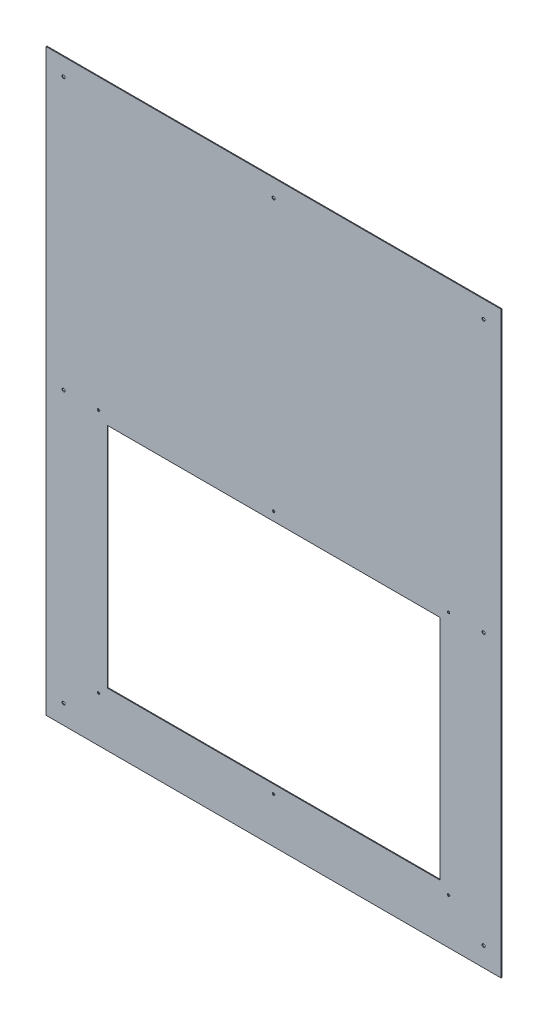
ISO-10303-21;
HEADER;
FILE_DESCRIPTION(('STEP AP214'),'2;1');
FILE_NAME('part.step','',(''),(''),'','','');
FILE_SCHEMA(('AUTOMOTIVE_DESIGN { 1 0 10303 214 1 1 1 1 }'));
ENDSEC;
DATA;
#1=APPLICATION_CONTEXT('core data for automotive mechanical design processes');
#2=APPLICATION_PROTOCOL_DEFINITION('international standard','automotive_design',2000,#1);
#3=PRODUCT_CONTEXT('',#1,'mechanical');
#4=PRODUCT('Part','Part','',(#3));
#5=PRODUCT_RELATED_PRODUCT_CATEGORY('part','',(#4));
#6=PRODUCT_DEFINITION_FORMATION('','',#4);
#7=PRODUCT_DEFINITION_CONTEXT('part definition',#1,'design');
#8=PRODUCT_DEFINITION('design','',#6,#7);
#9=PRODUCT_DEFINITION_SHAPE('','',#8);
#10=(LENGTH_UNIT() NAMED_UNIT(*) SI_UNIT(.MILLI.,.METRE.));
#11=(NAMED_UNIT(*) PLANE_ANGLE_UNIT() SI_UNIT($,.RADIAN.));
#12=(NAMED_UNIT(*) SI_UNIT($,.STERADIAN.) SOLID_ANGLE_UNIT());
#13=UNCERTAINTY_MEASURE_WITH_UNIT(LENGTH_MEASURE(1.E-05),#10,'distance_accuracy_value','');
#14=(GEOMETRIC_REPRESENTATION_CONTEXT(3) GLOBAL_UNCERTAINTY_ASSIGNED_CONTEXT((#13)) GLOBAL_UNIT_ASSIGNED_CONTEXT((#10,
#11,#12)) REPRESENTATION_CONTEXT('',''));
#15=CARTESIAN_POINT('',(0.,0.,0.));
#16=DIRECTION('',(0.,0.,1.));
#17=DIRECTION('',(1.,0.,0.));
#18=AXIS2_PLACEMENT_3D('',#15,#16,#17);
#19=CARTESIAN_POINT('',(0.,0.,1.2192));
#20=DIRECTION('',(1.,0.,0.));
#21=DIRECTION('',(0.,0.,-1.));
#22=AXIS2_PLACEMENT_3D('',#19,#20,#21);
#23=PLANE('',#22);
#24=DIRECTION('',(0.,-1.,0.));
#25=VECTOR('',#24,1.);
#26=CARTESIAN_POINT('',(0.,0.,0.));
#27=LINE('',#26,#25);
#28=CARTESIAN_POINT('',(0.,840.74,0.));
#29=VERTEX_POINT('',#28);
#30=CARTESIAN_POINT('',(0.,0.,0.));
#31=VERTEX_POINT('',#30);
#32=EDGE_CURVE('E169',#29,#31,#27,.T.);
#33=ORIENTED_EDGE('',*,*,#32,.T.);
#34=DIRECTION('',(0.,0.,-1.));
#35=VECTOR('',#34,1.);
#36=CARTESIAN_POINT('',(0.,0.,1.2192));
#37=LINE('',#36,#35);
#38=CARTESIAN_POINT('',(0.,0.,1.2192));
#39=VERTEX_POINT('',#38);
#40=EDGE_CURVE('E196',#39,#31,#37,.T.);
#41=ORIENTED_EDGE('',*,*,#40,.F.);
#42=DIRECTION('',(0.,-1.,0.));
#43=VECTOR('',#42,1.);
#44=CARTESIAN_POINT('',(0.,0.,1.2192));
#45=LINE('',#44,#43);
#46=CARTESIAN_POINT('',(0.,840.74,1.2192));
#47=VERTEX_POINT('',#46);
#48=EDGE_CURVE('E170',#47,#39,#45,.T.);
#49=ORIENTED_EDGE('',*,*,#48,.F.);
#50=DIRECTION('',(0.,0.,-1.));
#51=VECTOR('',#50,1.);
#52=CARTESIAN_POINT('',(0.,840.74,1.2192));
#53=LINE('',#52,#51);
#54=EDGE_CURVE('E180',#47,#29,#53,.T.);
#55=ORIENTED_EDGE('',*,*,#54,.T.);
#56=EDGE_LOOP('',(#33,#41,#49,#55));
#57=FACE_BOUND('',#56,.T.);
#58=ADVANCED_FACE('F34',(#57),#23,.F.);
#59=CARTESIAN_POINT('',(0.,0.,1.2192));
#60=DIRECTION('',(0.,1.,0.));
#61=DIRECTION('',(0.,0.,1.));
#62=AXIS2_PLACEMENT_3D('',#59,#60,#61);
#63=PLANE('',#62);
#64=DIRECTION('',(1.,0.,0.));
#65=VECTOR('',#64,1.);
#66=CARTESIAN_POINT('',(0.,0.,0.));
#67=LINE('',#66,#65);
#68=CARTESIAN_POINT('',(660.4,0.,0.));
#69=VERTEX_POINT('',#68);
#70=EDGE_CURVE('E183',#31,#69,#67,.T.);
#71=ORIENTED_EDGE('',*,*,#70,.T.);
#72=DIRECTION('',(0.,0.,-1.));
#73=VECTOR('',#72,1.);
#74=CARTESIAN_POINT('',(660.4,0.,1.2192));
#75=LINE('',#74,#73);
#76=CARTESIAN_POINT('',(660.4,0.,1.2192));
#77=VERTEX_POINT('',#76);
#78=EDGE_CURVE('E193',#77,#69,#75,.T.);
#79=ORIENTED_EDGE('',*,*,#78,.F.);
#80=DIRECTION('',(1.,0.,0.));
#81=VECTOR('',#80,1.);
#82=CARTESIAN_POINT('',(0.,0.,1.2192));
#83=LINE('',#82,#81);
#84=EDGE_CURVE('E173',#39,#77,#83,.T.);
#85=ORIENTED_EDGE('',*,*,#84,.F.);
#86=ORIENTED_EDGE('',*,*,#40,.T.);
#87=EDGE_LOOP('',(#71,#79,#85,#86));
#88=FACE_BOUND('',#87,.T.);
#89=ADVANCED_FACE('F256',(#88),#63,.F.);
#90=CARTESIAN_POINT('',(660.4,0.,1.2192));
#91=DIRECTION('',(-1.,0.,0.));
#92=DIRECTION('',(0.,0.,1.));
#93=AXIS2_PLACEMENT_3D('',#90,#91,#92);
#94=PLANE('',#93);
#95=DIRECTION('',(0.,1.,0.));
#96=VECTOR('',#95,1.);
#97=CARTESIAN_POINT('',(660.4,0.,0.));
#98=LINE('',#97,#96);
#99=CARTESIAN_POINT('',(660.4,840.74,0.));
#100=VERTEX_POINT('',#99);
#101=EDGE_CURVE('E185',#69,#100,#98,.T.);
#102=ORIENTED_EDGE('',*,*,#101,.T.);
#103=DIRECTION('',(0.,0.,-1.));
#104=VECTOR('',#103,1.);
#105=CARTESIAN_POINT('',(660.4,840.74,1.2192));
#106=LINE('',#105,#104);
#107=CARTESIAN_POINT('',(660.4,840.74,1.2192));
#108=VERTEX_POINT('',#107);
#109=EDGE_CURVE('E190',#108,#100,#106,.T.);
#110=ORIENTED_EDGE('',*,*,#109,.F.);
#111=DIRECTION('',(0.,1.,0.));
#112=VECTOR('',#111,1.);
#113=CARTESIAN_POINT('',(660.4,0.,1.2192));
#114=LINE('',#113,#112);
#115=EDGE_CURVE('E176',#77,#108,#114,.T.);
#116=ORIENTED_EDGE('',*,*,#115,.F.);
#117=ORIENTED_EDGE('',*,*,#78,.T.);
#118=EDGE_LOOP('',(#102,#110,#116,#117));
#119=FACE_BOUND('',#118,.T.);
#120=ADVANCED_FACE('F249',(#119),#94,.F.);
#121=CARTESIAN_POINT('',(0.,840.74,1.2192));
#122=DIRECTION('',(0.,-1.,0.));
#123=DIRECTION('',(0.,0.,-1.));
#124=AXIS2_PLACEMENT_3D('',#121,#122,#123);
#125=PLANE('',#124);
#126=DIRECTION('',(-1.,0.,0.));
#127=VECTOR('',#126,1.);
#128=CARTESIAN_POINT('',(0.,840.74,0.));
#129=LINE('',#128,#127);
#130=EDGE_CURVE('E174',#100,#29,#129,.T.);
#131=ORIENTED_EDGE('',*,*,#130,.T.);
#132=ORIENTED_EDGE('',*,*,#54,.F.);
#133=DIRECTION('',(-1.,0.,0.));
#134=VECTOR('',#133,1.);
#135=CARTESIAN_POINT('',(0.,840.74,1.2192));
#136=LINE('',#135,#134);
#137=EDGE_CURVE('E178',#108,#47,#136,.T.);
#138=ORIENTED_EDGE('',*,*,#137,.F.);
#139=ORIENTED_EDGE('',*,*,#109,.T.);
#140=EDGE_LOOP('',(#131,#132,#138,#139));
#141=FACE_BOUND('',#140,.T.);
#142=ADVANCED_FACE('F239',(#141),#125,.F.);
#143=CARTESIAN_POINT('',(0.,0.,1.2192));
#144=DIRECTION('',(0.,0.,-1.));
#145=DIRECTION('',(-1.,0.,0.));
#146=AXIS2_PLACEMENT_3D('',#143,#144,#145);
#147=PLANE('',#146);
#148=CARTESIAN_POINT('',(76.2,421.64,1.2192));
#149=DIRECTION('',(0.,0.,1.));
#150=DIRECTION('',(1.,0.,0.));
#151=AXIS2_PLACEMENT_3D('',#148,#149,#150);
#152=CIRCLE('',#151,1.72719999999998);
#153=CARTESIAN_POINT('',(77.9272,421.64,1.2192));
#154=VERTEX_POINT('',#153);
#155=EDGE_CURVE('E465',#154,#154,#152,.T.);
#156=ORIENTED_EDGE('',*,*,#155,.F.);
#157=EDGE_LOOP('',(#156));
#158=FACE_BOUND('',#157,.T.);
#159=CARTESIAN_POINT('',(330.2,421.64,1.2192));
#160=DIRECTION('',(0.,0.,1.));
#161=DIRECTION('',(1.,0.,0.));
#162=AXIS2_PLACEMENT_3D('',#159,#160,#161);
#163=CIRCLE('',#162,1.72719999999998);
#164=CARTESIAN_POINT('',(331.9272,421.64,1.2192));
#165=VERTEX_POINT('',#164);
#166=EDGE_CURVE('E223',#165,#165,#163,.T.);
#167=ORIENTED_EDGE('',*,*,#166,.F.);
#168=EDGE_LOOP('',(#167));
#169=FACE_BOUND('',#168,.T.);
#170=CARTESIAN_POINT('',(584.2,421.64,1.2192));
#171=DIRECTION('',(0.,0.,1.));
#172=DIRECTION('',(1.,0.,0.));
#173=AXIS2_PLACEMENT_3D('',#170,#171,#172);
#174=CIRCLE('',#173,1.72720000000004);
#175=CARTESIAN_POINT('',(585.9272,421.64,1.2192));
#176=VERTEX_POINT('',#175);
#177=EDGE_CURVE('E213',#176,#176,#174,.T.);
#178=ORIENTED_EDGE('',*,*,#177,.F.);
#179=EDGE_LOOP('',(#178));
#180=FACE_BOUND('',#179,.T.);
#181=CARTESIAN_POINT('',(584.2,66.0400000000001,1.2192));
#182=DIRECTION('',(0.,0.,1.));
#183=DIRECTION('',(1.,0.,0.));
#184=AXIS2_PLACEMENT_3D('',#181,#182,#183);
#185=CIRCLE('',#184,1.72720000000004);
#186=CARTESIAN_POINT('',(585.9272,66.0400000000001,1.2192));
#187=VERTEX_POINT('',#186);
#188=EDGE_CURVE('E210',#187,#187,#185,.T.);
#189=ORIENTED_EDGE('',*,*,#188,.F.);
#190=EDGE_LOOP('',(#189));
#191=FACE_BOUND('',#190,.T.);
#192=CARTESIAN_POINT('',(330.2,66.0400000000001,1.2192));
#193=DIRECTION('',(0.,0.,1.));
#194=DIRECTION('',(1.,0.,0.));
#195=AXIS2_PLACEMENT_3D('',#192,#193,#194);
#196=CIRCLE('',#195,1.72719999999998);
#197=CARTESIAN_POINT('',(331.9272,66.0400000000001,1.2192));
#198=VERTEX_POINT('',#197);
#199=EDGE_CURVE('E209',#198,#198,#196,.T.);
#200=ORIENTED_EDGE('',*,*,#199,.F.);
#201=EDGE_LOOP('',(#200));
#202=FACE_BOUND('',#201,.T.);
#203=CARTESIAN_POINT('',(76.2,66.0400000000001,1.2192));
#204=DIRECTION('',(0.,0.,1.));
#205=DIRECTION('',(1.,0.,0.));
#206=AXIS2_PLACEMENT_3D('',#203,#204,#205);
#207=CIRCLE('',#206,1.72719999999998);
#208=CARTESIAN_POINT('',(77.9272,66.0400000000001,1.2192));
#209=VERTEX_POINT('',#208);
#210=EDGE_CURVE('E206',#209,#209,#207,.T.);
#211=ORIENTED_EDGE('',*,*,#210,.F.);
#212=EDGE_LOOP('',(#211));
#213=FACE_BOUND('',#212,.T.);
#214=DIRECTION('',(1.,0.,0.));
#215=VECTOR('',#214,1.);
#216=CARTESIAN_POINT('',(88.9,78.7400000000001,1.2192));
#217=LINE('',#216,#215);
#218=CARTESIAN_POINT('',(88.9,78.7400000000001,1.2192));
#219=VERTEX_POINT('',#218);
#220=CARTESIAN_POINT('',(571.5,78.7400000000001,1.2192));
#221=VERTEX_POINT('',#220);
#222=EDGE_CURVE('E111',#219,#221,#217,.T.);
#223=ORIENTED_EDGE('',*,*,#222,.F.);
#224=DIRECTION('',(0.,-1.,0.));
#225=VECTOR('',#224,1.);
#226=CARTESIAN_POINT('',(88.9,408.94,1.2192));
#227=LINE('',#226,#225);
#228=CARTESIAN_POINT('',(88.9,408.94,1.2192));
#229=VERTEX_POINT('',#228);
#230=EDGE_CURVE('E50',#229,#219,#227,.T.);
#231=ORIENTED_EDGE('',*,*,#230,.F.);
#232=DIRECTION('',(-1.,0.,0.));
#233=VECTOR('',#232,1.);
#234=CARTESIAN_POINT('',(88.9,408.94,1.2192));
#235=LINE('',#234,#233);
#236=CARTESIAN_POINT('',(571.5,408.94,1.2192));
#237=VERTEX_POINT('',#236);
#238=EDGE_CURVE('E118',#237,#229,#235,.T.);
#239=ORIENTED_EDGE('',*,*,#238,.F.);
#240=DIRECTION('',(0.,1.,0.));
#241=VECTOR('',#240,1.);
#242=CARTESIAN_POINT('',(571.5,408.94,1.2192));
#243=LINE('',#242,#241);
#244=EDGE_CURVE('E102',#221,#237,#243,.T.);
#245=ORIENTED_EDGE('',*,*,#244,.F.);
#246=EDGE_LOOP('',(#223,#231,#239,#245));
#247=FACE_BOUND('',#246,.T.);
#248=CARTESIAN_POINT('',(25.4,815.34,1.2192));
#249=DIRECTION('',(0.,0.,1.));
#250=DIRECTION('',(1.,0.,0.));
#251=AXIS2_PLACEMENT_3D('',#248,#249,#250);
#252=CIRCLE('',#251,2.2479);
#253=CARTESIAN_POINT('',(27.6479,815.34,1.2192));
#254=VERTEX_POINT('',#253);
#255=EDGE_CURVE('E125',#254,#254,#252,.T.);
#256=ORIENTED_EDGE('',*,*,#255,.F.);
#257=EDGE_LOOP('',(#256));
#258=FACE_BOUND('',#257,.T.);
#259=CARTESIAN_POINT('',(330.2,815.34,1.2192));
#260=DIRECTION('',(0.,0.,1.));
#261=DIRECTION('',(1.,0.,0.));
#262=AXIS2_PLACEMENT_3D('',#259,#260,#261);
#263=CIRCLE('',#262,2.24790000000002);
#264=CARTESIAN_POINT('',(332.4479,815.34,1.2192));
#265=VERTEX_POINT('',#264);
#266=EDGE_CURVE('E133',#265,#265,#263,.T.);
#267=ORIENTED_EDGE('',*,*,#266,.F.);
#268=EDGE_LOOP('',(#267));
#269=FACE_BOUND('',#268,.T.);
#270=CARTESIAN_POINT('',(635.,815.34,1.2192));
#271=DIRECTION('',(0.,0.,1.));
#272=DIRECTION('',(1.,0.,0.));
#273=AXIS2_PLACEMENT_3D('',#270,#271,#272);
#274=CIRCLE('',#273,2.24789999999997);
#275=CARTESIAN_POINT('',(637.2479,815.34,1.2192));
#276=VERTEX_POINT('',#275);
#277=EDGE_CURVE('E139',#276,#276,#274,.T.);
#278=ORIENTED_EDGE('',*,*,#277,.F.);
#279=EDGE_LOOP('',(#278));
#280=FACE_BOUND('',#279,.T.);
#281=CARTESIAN_POINT('',(25.4,421.64,1.2192));
#282=DIRECTION('',(0.,0.,1.));
#283=DIRECTION('',(1.,0.,0.));
#284=AXIS2_PLACEMENT_3D('',#281,#282,#283);
#285=CIRCLE('',#284,2.2479);
#286=CARTESIAN_POINT('',(27.6479,421.64,1.2192));
#287=VERTEX_POINT('',#286);
#288=EDGE_CURVE('E145',#287,#287,#285,.T.);
#289=ORIENTED_EDGE('',*,*,#288,.F.);
#290=EDGE_LOOP('',(#289));
#291=FACE_BOUND('',#290,.T.);
#292=CARTESIAN_POINT('',(25.4000000000001,27.9400000000002,1.2192));
#293=DIRECTION('',(0.,0.,1.));
#294=DIRECTION('',(1.,0.,0.));
#295=AXIS2_PLACEMENT_3D('',#292,#293,#294);
#296=CIRCLE('',#295,2.2479);
#297=CARTESIAN_POINT('',(27.6479000000001,27.9400000000002,1.2192));
#298=VERTEX_POINT('',#297);
#299=EDGE_CURVE('E151',#298,#298,#296,.T.);
#300=ORIENTED_EDGE('',*,*,#299,.F.);
#301=EDGE_LOOP('',(#300));
#302=FACE_BOUND('',#301,.T.);
#303=CARTESIAN_POINT('',(635.,27.9400000000003,1.2192));
#304=DIRECTION('',(0.,0.,1.));
#305=DIRECTION('',(1.,0.,0.));
#306=AXIS2_PLACEMENT_3D('',#303,#304,#305);
#307=CIRCLE('',#306,2.24789999999997);
#308=CARTESIAN_POINT('',(637.2479,27.9400000000003,1.2192));
#309=VERTEX_POINT('',#308);
#310=EDGE_CURVE('E157',#309,#309,#307,.T.);
#311=ORIENTED_EDGE('',*,*,#310,.F.);
#312=EDGE_LOOP('',(#311));
#313=FACE_BOUND('',#312,.T.);
#314=CARTESIAN_POINT('',(635.,421.64,1.2192));
#315=DIRECTION('',(0.,0.,1.));
#316=DIRECTION('',(1.,0.,0.));
#317=AXIS2_PLACEMENT_3D('',#314,#315,#316);
#318=CIRCLE('',#317,2.24789999999997);
#319=CARTESIAN_POINT('',(637.2479,421.64,1.2192));
#320=VERTEX_POINT('',#319);
#321=EDGE_CURVE('E163',#320,#320,#318,.T.);
#322=ORIENTED_EDGE('',*,*,#321,.F.);
#323=EDGE_LOOP('',(#322));
#324=FACE_BOUND('',#323,.T.);
#325=ORIENTED_EDGE('',*,*,#48,.T.);
#326=ORIENTED_EDGE('',*,*,#84,.T.);
#327=ORIENTED_EDGE('',*,*,#115,.T.);
#328=ORIENTED_EDGE('',*,*,#137,.T.);
#329=EDGE_LOOP('',(#325,#326,#327,#328));
#330=FACE_BOUND('',#329,.T.);
#331=ADVANCED_FACE('F115',(#158,#169,#180,#191,#202,#213,#247,#258,#269,#280,#291,#302,#313,
#324,#330),#147,.F.);
#332=CARTESIAN_POINT('',(0.,0.,0.));
#333=DIRECTION('',(0.,0.,-1.));
#334=DIRECTION('',(-1.,0.,0.));
#335=AXIS2_PLACEMENT_3D('',#332,#333,#334);
#336=PLANE('',#335);
#337=CARTESIAN_POINT('',(76.2,421.64,0.));
#338=DIRECTION('',(0.,0.,-1.));
#339=DIRECTION('',(-1.,0.,0.));
#340=AXIS2_PLACEMENT_3D('',#337,#338,#339);
#341=CIRCLE('',#340,1.72719999999998);
#342=CARTESIAN_POINT('',(74.4728,421.64,0.));
#343=VERTEX_POINT('',#342);
#344=EDGE_CURVE('E463',#343,#343,#341,.T.);
#345=ORIENTED_EDGE('',*,*,#344,.F.);
#346=EDGE_LOOP('',(#345));
#347=FACE_BOUND('',#346,.T.);
#348=CARTESIAN_POINT('',(330.2,421.64,0.));
#349=DIRECTION('',(0.,0.,-1.));
#350=DIRECTION('',(-1.,0.,0.));
#351=AXIS2_PLACEMENT_3D('',#348,#349,#350);
#352=CIRCLE('',#351,1.72719999999998);
#353=CARTESIAN_POINT('',(328.4728,421.64,0.));
#354=VERTEX_POINT('',#353);
#355=EDGE_CURVE('E37',#354,#354,#352,.T.);
#356=ORIENTED_EDGE('',*,*,#355,.F.);
#357=EDGE_LOOP('',(#356));
#358=FACE_BOUND('',#357,.T.);
#359=CARTESIAN_POINT('',(584.2,421.64,0.));
#360=DIRECTION('',(0.,0.,-1.));
#361=DIRECTION('',(-1.,0.,0.));
#362=AXIS2_PLACEMENT_3D('',#359,#360,#361);
#363=CIRCLE('',#362,1.72720000000004);
#364=CARTESIAN_POINT('',(582.4728,421.64,0.));
#365=VERTEX_POINT('',#364);
#366=EDGE_CURVE('E211',#365,#365,#363,.T.);
#367=ORIENTED_EDGE('',*,*,#366,.F.);
#368=EDGE_LOOP('',(#367));
#369=FACE_BOUND('',#368,.T.);
#370=CARTESIAN_POINT('',(584.2,66.0400000000001,0.));
#371=DIRECTION('',(0.,0.,-1.));
#372=DIRECTION('',(-1.,0.,0.));
#373=AXIS2_PLACEMENT_3D('',#370,#371,#372);
#374=CIRCLE('',#373,1.72720000000004);
#375=CARTESIAN_POINT('',(582.4728,66.0400000000001,0.));
#376=VERTEX_POINT('',#375);
#377=EDGE_CURVE('E207',#376,#376,#374,.T.);
#378=ORIENTED_EDGE('',*,*,#377,.F.);
#379=EDGE_LOOP('',(#378));
#380=FACE_BOUND('',#379,.T.);
#381=CARTESIAN_POINT('',(330.2,66.0400000000001,0.));
#382=DIRECTION('',(0.,0.,-1.));
#383=DIRECTION('',(-1.,0.,0.));
#384=AXIS2_PLACEMENT_3D('',#381,#382,#383);
#385=CIRCLE('',#384,1.72719999999998);
#386=CARTESIAN_POINT('',(328.4728,66.0400000000001,0.));
#387=VERTEX_POINT('',#386);
#388=EDGE_CURVE('E229',#387,#387,#385,.T.);
#389=ORIENTED_EDGE('',*,*,#388,.F.);
#390=EDGE_LOOP('',(#389));
#391=FACE_BOUND('',#390,.T.);
#392=CARTESIAN_POINT('',(76.2,66.0400000000001,0.));
#393=DIRECTION('',(0.,0.,-1.));
#394=DIRECTION('',(-1.,0.,0.));
#395=AXIS2_PLACEMENT_3D('',#392,#393,#394);
#396=CIRCLE('',#395,1.72719999999998);
#397=CARTESIAN_POINT('',(74.4728,66.0400000000001,0.));
#398=VERTEX_POINT('',#397);
#399=EDGE_CURVE('E203',#398,#398,#396,.T.);
#400=ORIENTED_EDGE('',*,*,#399,.F.);
#401=EDGE_LOOP('',(#400));
#402=FACE_BOUND('',#401,.T.);
#403=DIRECTION('',(0.,1.,0.));
#404=VECTOR('',#403,1.);
#405=CARTESIAN_POINT('',(88.9,0.,0.));
#406=LINE('',#405,#404);
#407=CARTESIAN_POINT('',(88.9,78.7400000000001,0.));
#408=VERTEX_POINT('',#407);
#409=CARTESIAN_POINT('',(88.9,408.94,0.));
#410=VERTEX_POINT('',#409);
#411=EDGE_CURVE('E11',#408,#410,#406,.T.);
#412=ORIENTED_EDGE('',*,*,#411,.F.);
#413=DIRECTION('',(-1.,0.,0.));
#414=VECTOR('',#413,1.);
#415=CARTESIAN_POINT('',(0.,78.7400000000001,0.));
#416=LINE('',#415,#414);
#417=CARTESIAN_POINT('',(571.5,78.7400000000001,0.));
#418=VERTEX_POINT('',#417);
#419=EDGE_CURVE('E199',#418,#408,#416,.T.);
#420=ORIENTED_EDGE('',*,*,#419,.F.);
#421=DIRECTION('',(0.,-1.,0.));
#422=VECTOR('',#421,1.);
#423=CARTESIAN_POINT('',(571.5,1.92153985031277E-13,0.));
#424=LINE('',#423,#422);
#425=CARTESIAN_POINT('',(571.5,408.94,0.));
#426=VERTEX_POINT('',#425);
#427=EDGE_CURVE('E105',#426,#418,#424,.T.);
#428=ORIENTED_EDGE('',*,*,#427,.F.);
#429=DIRECTION('',(1.,0.,0.));
#430=VECTOR('',#429,1.);
#431=CARTESIAN_POINT('',(0.,408.94,0.));
#432=LINE('',#431,#430);
#433=EDGE_CURVE('E42',#410,#426,#432,.T.);
#434=ORIENTED_EDGE('',*,*,#433,.F.);
#435=EDGE_LOOP('',(#412,#420,#428,#434));
#436=FACE_BOUND('',#435,.T.);
#437=CARTESIAN_POINT('',(25.4,815.34,0.));
#438=DIRECTION('',(0.,0.,1.));
#439=DIRECTION('',(1.,0.,0.));
#440=AXIS2_PLACEMENT_3D('',#437,#438,#439);
#441=CIRCLE('',#440,2.2479);
#442=CARTESIAN_POINT('',(27.6479,815.34,0.));
#443=VERTEX_POINT('',#442);
#444=EDGE_CURVE('E130',#443,#443,#441,.T.);
#445=ORIENTED_EDGE('',*,*,#444,.T.);
#446=EDGE_LOOP('',(#445));
#447=FACE_BOUND('',#446,.T.);
#448=CARTESIAN_POINT('',(330.2,815.34,0.));
#449=DIRECTION('',(0.,0.,1.));
#450=DIRECTION('',(1.,0.,0.));
#451=AXIS2_PLACEMENT_3D('',#448,#449,#450);
#452=CIRCLE('',#451,2.24790000000002);
#453=CARTESIAN_POINT('',(332.4479,815.34,0.));
#454=VERTEX_POINT('',#453);
#455=EDGE_CURVE('E136',#454,#454,#452,.T.);
#456=ORIENTED_EDGE('',*,*,#455,.T.);
#457=EDGE_LOOP('',(#456));
#458=FACE_BOUND('',#457,.T.);
#459=CARTESIAN_POINT('',(635.,815.34,0.));
#460=DIRECTION('',(0.,0.,1.));
#461=DIRECTION('',(1.,0.,0.));
#462=AXIS2_PLACEMENT_3D('',#459,#460,#461);
#463=CIRCLE('',#462,2.24789999999997);
#464=CARTESIAN_POINT('',(637.2479,815.34,0.));
#465=VERTEX_POINT('',#464);
#466=EDGE_CURVE('E142',#465,#465,#463,.T.);
#467=ORIENTED_EDGE('',*,*,#466,.T.);
#468=EDGE_LOOP('',(#467));
#469=FACE_BOUND('',#468,.T.);
#470=CARTESIAN_POINT('',(25.4,421.64,0.));
#471=DIRECTION('',(0.,0.,1.));
#472=DIRECTION('',(1.,0.,0.));
#473=AXIS2_PLACEMENT_3D('',#470,#471,#472);
#474=CIRCLE('',#473,2.2479);
#475=CARTESIAN_POINT('',(27.6479,421.64,0.));
#476=VERTEX_POINT('',#475);
#477=EDGE_CURVE('E148',#476,#476,#474,.T.);
#478=ORIENTED_EDGE('',*,*,#477,.T.);
#479=EDGE_LOOP('',(#478));
#480=FACE_BOUND('',#479,.T.);
#481=CARTESIAN_POINT('',(25.4000000000001,27.9400000000002,0.));
#482=DIRECTION('',(0.,0.,1.));
#483=DIRECTION('',(1.,0.,0.));
#484=AXIS2_PLACEMENT_3D('',#481,#482,#483);
#485=CIRCLE('',#484,2.2479);
#486=CARTESIAN_POINT('',(27.6479000000001,27.9400000000002,0.));
#487=VERTEX_POINT('',#486);
#488=EDGE_CURVE('E154',#487,#487,#485,.T.);
#489=ORIENTED_EDGE('',*,*,#488,.T.);
#490=EDGE_LOOP('',(#489));
#491=FACE_BOUND('',#490,.T.);
#492=CARTESIAN_POINT('',(635.,27.9400000000003,0.));
#493=DIRECTION('',(0.,0.,1.));
#494=DIRECTION('',(1.,0.,0.));
#495=AXIS2_PLACEMENT_3D('',#492,#493,#494);
#496=CIRCLE('',#495,2.24789999999997);
#497=CARTESIAN_POINT('',(637.2479,27.9400000000003,0.));
#498=VERTEX_POINT('',#497);
#499=EDGE_CURVE('E160',#498,#498,#496,.T.);
#500=ORIENTED_EDGE('',*,*,#499,.T.);
#501=EDGE_LOOP('',(#500));
#502=FACE_BOUND('',#501,.T.);
#503=CARTESIAN_POINT('',(635.,421.64,0.));
#504=DIRECTION('',(0.,0.,1.));
#505=DIRECTION('',(1.,0.,0.));
#506=AXIS2_PLACEMENT_3D('',#503,#504,#505);
#507=CIRCLE('',#506,2.24789999999997);
#508=CARTESIAN_POINT('',(637.2479,421.64,0.));
#509=VERTEX_POINT('',#508);
#510=EDGE_CURVE('E166',#509,#509,#507,.T.);
#511=ORIENTED_EDGE('',*,*,#510,.T.);
#512=EDGE_LOOP('',(#511));
#513=FACE_BOUND('',#512,.T.);
#514=ORIENTED_EDGE('',*,*,#32,.F.);
#515=ORIENTED_EDGE('',*,*,#130,.F.);
#516=ORIENTED_EDGE('',*,*,#101,.F.);
#517=ORIENTED_EDGE('',*,*,#70,.F.);
#518=EDGE_LOOP('',(#514,#515,#516,#517));
#519=FACE_BOUND('',#518,.T.);
#520=ADVANCED_FACE('F238',(#347,#358,#369,#380,#391,#402,#436,#447,#458,#469,#480,#491,#502,
#513,#519),#336,.T.);
#521=CARTESIAN_POINT('',(635.,421.64,1.2192));
#522=DIRECTION('',(0.,0.,1.));
#523=DIRECTION('',(1.,0.,0.));
#524=AXIS2_PLACEMENT_3D('',#521,#522,#523);
#525=CYLINDRICAL_SURFACE('',#524,2.24789999999997);
#526=ORIENTED_EDGE('',*,*,#510,.F.);
#527=EDGE_LOOP('',(#526));
#528=FACE_BOUND('',#527,.T.);
#529=ORIENTED_EDGE('',*,*,#321,.T.);
#530=EDGE_LOOP('',(#529));
#531=FACE_BOUND('',#530,.T.);
#532=ADVANCED_FACE('F246',(#528,#531),#525,.F.);
#533=CARTESIAN_POINT('',(635.,27.9400000000003,1.2192));
#534=DIRECTION('',(0.,0.,1.));
#535=DIRECTION('',(1.,0.,0.));
#536=AXIS2_PLACEMENT_3D('',#533,#534,#535);
#537=CYLINDRICAL_SURFACE('',#536,2.24789999999997);
#538=ORIENTED_EDGE('',*,*,#499,.F.);
#539=EDGE_LOOP('',(#538));
#540=FACE_BOUND('',#539,.T.);
#541=ORIENTED_EDGE('',*,*,#310,.T.);
#542=EDGE_LOOP('',(#541));
#543=FACE_BOUND('',#542,.T.);
#544=ADVANCED_FACE('F295',(#540,#543),#537,.F.);
#545=CARTESIAN_POINT('',(25.4000000000001,27.9400000000002,1.2192));
#546=DIRECTION('',(0.,0.,1.));
#547=DIRECTION('',(1.,0.,0.));
#548=AXIS2_PLACEMENT_3D('',#545,#546,#547);
#549=CYLINDRICAL_SURFACE('',#548,2.2479);
#550=ORIENTED_EDGE('',*,*,#488,.F.);
#551=EDGE_LOOP('',(#550));
#552=FACE_BOUND('',#551,.T.);
#553=ORIENTED_EDGE('',*,*,#299,.T.);
#554=EDGE_LOOP('',(#553));
#555=FACE_BOUND('',#554,.T.);
#556=ADVANCED_FACE('F305',(#552,#555),#549,.F.);
#557=CARTESIAN_POINT('',(25.4,421.64,1.2192));
#558=DIRECTION('',(0.,0.,1.));
#559=DIRECTION('',(1.,0.,0.));
#560=AXIS2_PLACEMENT_3D('',#557,#558,#559);
#561=CYLINDRICAL_SURFACE('',#560,2.2479);
#562=ORIENTED_EDGE('',*,*,#477,.F.);
#563=EDGE_LOOP('',(#562));
#564=FACE_BOUND('',#563,.T.);
#565=ORIENTED_EDGE('',*,*,#288,.T.);
#566=EDGE_LOOP('',(#565));
#567=FACE_BOUND('',#566,.T.);
#568=ADVANCED_FACE('F315',(#564,#567),#561,.F.);
#569=CARTESIAN_POINT('',(635.,815.34,1.2192));
#570=DIRECTION('',(0.,0.,1.));
#571=DIRECTION('',(1.,0.,0.));
#572=AXIS2_PLACEMENT_3D('',#569,#570,#571);
#573=CYLINDRICAL_SURFACE('',#572,2.24789999999997);
#574=ORIENTED_EDGE('',*,*,#466,.F.);
#575=EDGE_LOOP('',(#574));
#576=FACE_BOUND('',#575,.T.);
#577=ORIENTED_EDGE('',*,*,#277,.T.);
#578=EDGE_LOOP('',(#577));
#579=FACE_BOUND('',#578,.T.);
#580=ADVANCED_FACE('F325',(#576,#579),#573,.F.);
#581=CARTESIAN_POINT('',(330.2,815.34,1.2192));
#582=DIRECTION('',(0.,0.,1.));
#583=DIRECTION('',(1.,0.,0.));
#584=AXIS2_PLACEMENT_3D('',#581,#582,#583);
#585=CYLINDRICAL_SURFACE('',#584,2.24790000000002);
#586=ORIENTED_EDGE('',*,*,#455,.F.);
#587=EDGE_LOOP('',(#586));
#588=FACE_BOUND('',#587,.T.);
#589=ORIENTED_EDGE('',*,*,#266,.T.);
#590=EDGE_LOOP('',(#589));
#591=FACE_BOUND('',#590,.T.);
#592=ADVANCED_FACE('F335',(#588,#591),#585,.F.);
#593=CARTESIAN_POINT('',(25.4,815.34,1.2192));
#594=DIRECTION('',(0.,0.,1.));
#595=DIRECTION('',(1.,0.,0.));
#596=AXIS2_PLACEMENT_3D('',#593,#594,#595);
#597=CYLINDRICAL_SURFACE('',#596,2.2479);
#598=ORIENTED_EDGE('',*,*,#444,.F.);
#599=EDGE_LOOP('',(#598));
#600=FACE_BOUND('',#599,.T.);
#601=ORIENTED_EDGE('',*,*,#255,.T.);
#602=EDGE_LOOP('',(#601));
#603=FACE_BOUND('',#602,.T.);
#604=ADVANCED_FACE('F345',(#600,#603),#597,.F.);
#605=CARTESIAN_POINT('',(88.9,408.94,-1.3208));
#606=DIRECTION('',(-1.,0.,0.));
#607=DIRECTION('',(0.,-1.,0.));
#608=AXIS2_PLACEMENT_3D('',#605,#606,#607);
#609=PLANE('',#608);
#610=ORIENTED_EDGE('',*,*,#411,.T.);
#611=DIRECTION('',(0.,0.,1.));
#612=VECTOR('',#611,1.);
#613=CARTESIAN_POINT('',(88.9,408.94,-1.3208));
#614=LINE('',#613,#612);
#615=EDGE_CURVE('E123',#410,#229,#614,.T.);
#616=ORIENTED_EDGE('',*,*,#615,.T.);
#617=ORIENTED_EDGE('',*,*,#230,.T.);
#618=DIRECTION('',(0.,0.,1.));
#619=VECTOR('',#618,1.);
#620=CARTESIAN_POINT('',(88.9,78.7400000000001,-1.3208));
#621=LINE('',#620,#619);
#622=EDGE_CURVE('E108',#408,#219,#621,.T.);
#623=ORIENTED_EDGE('',*,*,#622,.F.);
#624=EDGE_LOOP('',(#610,#616,#617,#623));
#625=FACE_BOUND('',#624,.T.);
#626=ADVANCED_FACE('F355',(#625),#609,.F.);
#627=CARTESIAN_POINT('',(88.9,408.94,-1.3208));
#628=DIRECTION('',(0.,1.,0.));
#629=DIRECTION('',(0.,0.,1.));
#630=AXIS2_PLACEMENT_3D('',#627,#628,#629);
#631=PLANE('',#630);
#632=ORIENTED_EDGE('',*,*,#433,.T.);
#633=DIRECTION('',(0.,0.,1.));
#634=VECTOR('',#633,1.);
#635=CARTESIAN_POINT('',(571.5,408.94,-1.3208));
#636=LINE('',#635,#634);
#637=EDGE_CURVE('E107',#426,#237,#636,.T.);
#638=ORIENTED_EDGE('',*,*,#637,.T.);
#639=ORIENTED_EDGE('',*,*,#238,.T.);
#640=ORIENTED_EDGE('',*,*,#615,.F.);
#641=EDGE_LOOP('',(#632,#638,#639,#640));
#642=FACE_BOUND('',#641,.T.);
#643=ADVANCED_FACE('F365',(#642),#631,.F.);
#644=CARTESIAN_POINT('',(571.5,408.94,-1.3208));
#645=DIRECTION('',(1.,0.,0.));
#646=DIRECTION('',(0.,1.,0.));
#647=AXIS2_PLACEMENT_3D('',#644,#645,#646);
#648=PLANE('',#647);
#649=ORIENTED_EDGE('',*,*,#427,.T.);
#650=DIRECTION('',(0.,0.,1.));
#651=VECTOR('',#650,1.);
#652=CARTESIAN_POINT('',(571.5,78.7400000000001,-1.3208));
#653=LINE('',#652,#651);
#654=EDGE_CURVE('E58',#418,#221,#653,.T.);
#655=ORIENTED_EDGE('',*,*,#654,.T.);
#656=ORIENTED_EDGE('',*,*,#244,.T.);
#657=ORIENTED_EDGE('',*,*,#637,.F.);
#658=EDGE_LOOP('',(#649,#655,#656,#657));
#659=FACE_BOUND('',#658,.T.);
#660=ADVANCED_FACE('F99',(#659),#648,.F.);
#661=CARTESIAN_POINT('',(88.9,78.7400000000001,-1.3208));
#662=DIRECTION('',(0.,-1.,0.));
#663=DIRECTION('',(0.,0.,-1.));
#664=AXIS2_PLACEMENT_3D('',#661,#662,#663);
#665=PLANE('',#664);
#666=ORIENTED_EDGE('',*,*,#419,.T.);
#667=ORIENTED_EDGE('',*,*,#622,.T.);
#668=ORIENTED_EDGE('',*,*,#222,.T.);
#669=ORIENTED_EDGE('',*,*,#654,.F.);
#670=EDGE_LOOP('',(#666,#667,#668,#669));
#671=FACE_BOUND('',#670,.T.);
#672=ADVANCED_FACE('F112',(#671),#665,.F.);
#673=CARTESIAN_POINT('',(76.2,66.0400000000001,1.2192));
#674=DIRECTION('',(0.,0.,1.));
#675=DIRECTION('',(1.,0.,0.));
#676=AXIS2_PLACEMENT_3D('',#673,#674,#675);
#677=CYLINDRICAL_SURFACE('',#676,1.72719999999998);
#678=ORIENTED_EDGE('',*,*,#399,.T.);
#679=EDGE_LOOP('',(#678));
#680=FACE_BOUND('',#679,.T.);
#681=ORIENTED_EDGE('',*,*,#210,.T.);
#682=EDGE_LOOP('',(#681));
#683=FACE_BOUND('',#682,.T.);
#684=ADVANCED_FACE('F235',(#680,#683),#677,.F.);
#685=CARTESIAN_POINT('',(330.2,66.0400000000001,1.2192));
#686=DIRECTION('',(0.,0.,1.));
#687=DIRECTION('',(1.,0.,0.));
#688=AXIS2_PLACEMENT_3D('',#685,#686,#687);
#689=CYLINDRICAL_SURFACE('',#688,1.72719999999998);
#690=ORIENTED_EDGE('',*,*,#388,.T.);
#691=EDGE_LOOP('',(#690));
#692=FACE_BOUND('',#691,.T.);
#693=ORIENTED_EDGE('',*,*,#199,.T.);
#694=EDGE_LOOP('',(#693));
#695=FACE_BOUND('',#694,.T.);
#696=ADVANCED_FACE('F407',(#692,#695),#689,.F.);
#697=CARTESIAN_POINT('',(584.2,66.0400000000001,1.2192));
#698=DIRECTION('',(0.,0.,1.));
#699=DIRECTION('',(1.,0.,0.));
#700=AXIS2_PLACEMENT_3D('',#697,#698,#699);
#701=CYLINDRICAL_SURFACE('',#700,1.72720000000004);
#702=ORIENTED_EDGE('',*,*,#377,.T.);
#703=EDGE_LOOP('',(#702));
#704=FACE_BOUND('',#703,.T.);
#705=ORIENTED_EDGE('',*,*,#188,.T.);
#706=EDGE_LOOP('',(#705));
#707=FACE_BOUND('',#706,.T.);
#708=ADVANCED_FACE('F417',(#704,#707),#701,.F.);
#709=CARTESIAN_POINT('',(584.2,421.64,1.2192));
#710=DIRECTION('',(0.,0.,1.));
#711=DIRECTION('',(1.,0.,0.));
#712=AXIS2_PLACEMENT_3D('',#709,#710,#711);
#713=CYLINDRICAL_SURFACE('',#712,1.72720000000004);
#714=ORIENTED_EDGE('',*,*,#366,.T.);
#715=EDGE_LOOP('',(#714));
#716=FACE_BOUND('',#715,.T.);
#717=ORIENTED_EDGE('',*,*,#177,.T.);
#718=EDGE_LOOP('',(#717));
#719=FACE_BOUND('',#718,.T.);
#720=ADVANCED_FACE('F427',(#716,#719),#713,.F.);
#721=CARTESIAN_POINT('',(330.2,421.64,1.2192));
#722=DIRECTION('',(0.,0.,1.));
#723=DIRECTION('',(1.,0.,0.));
#724=AXIS2_PLACEMENT_3D('',#721,#722,#723);
#725=CYLINDRICAL_SURFACE('',#724,1.72719999999998);
#726=ORIENTED_EDGE('',*,*,#355,.T.);
#727=EDGE_LOOP('',(#726));
#728=FACE_BOUND('',#727,.T.);
#729=ORIENTED_EDGE('',*,*,#166,.T.);
#730=EDGE_LOOP('',(#729));
#731=FACE_BOUND('',#730,.T.);
#732=ADVANCED_FACE('F437',(#728,#731),#725,.F.);
#733=CARTESIAN_POINT('',(76.2,421.64,1.2192));
#734=DIRECTION('',(0.,0.,1.));
#735=DIRECTION('',(1.,0.,0.));
#736=AXIS2_PLACEMENT_3D('',#733,#734,#735);
#737=CYLINDRICAL_SURFACE('',#736,1.72719999999998);
#738=ORIENTED_EDGE('',*,*,#344,.T.);
#739=EDGE_LOOP('',(#738));
#740=FACE_BOUND('',#739,.T.);
#741=ORIENTED_EDGE('',*,*,#155,.T.);
#742=EDGE_LOOP('',(#741));
#743=FACE_BOUND('',#742,.T.);
#744=ADVANCED_FACE('F446',(#740,#743),#737,.F.);
#745=CLOSED_SHELL('',(#58,#89,#120,#142,#331,#520,#532,#544,#556,#568,#580,#592,#604,#626,#643,
#660,#672,#684,#696,#708,#720,#732,#744));
#746=MANIFOLD_SOLID_BREP('B2',#745);
#747=ADVANCED_BREP_SHAPE_REPRESENTATION('',(#18,#746),#14);
#748=SHAPE_DEFINITION_REPRESENTATION(#9,#747);
ENDSEC;
END-ISO-10303-21;
